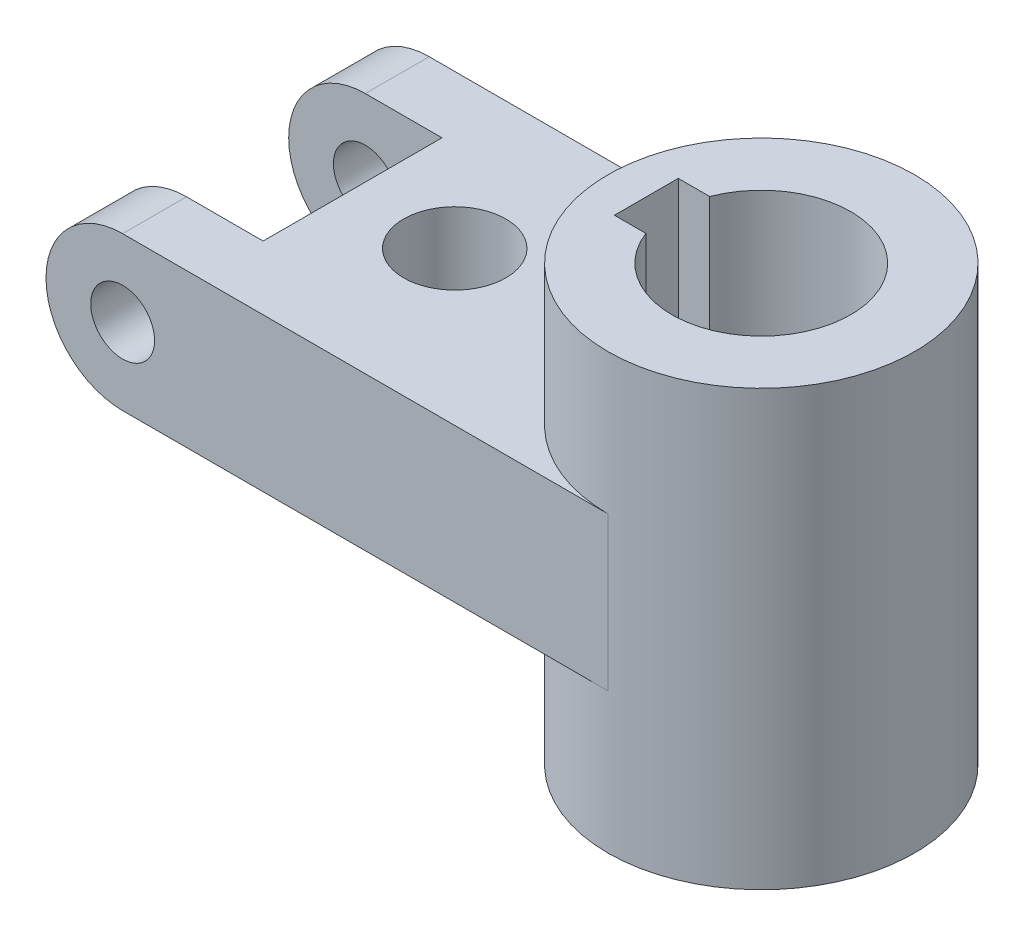
ISO-10303-21;
HEADER;
FILE_DESCRIPTION(('STEP AP214'),'2;1');
FILE_NAME('part.step','',(''),(''),'','','');
FILE_SCHEMA(('AUTOMOTIVE_DESIGN { 1 0 10303 214 1 1 1 1 }'));
ENDSEC;
DATA;
#1=APPLICATION_CONTEXT('core data for automotive mechanical design processes');
#2=APPLICATION_PROTOCOL_DEFINITION('international standard','automotive_design',2000,#1);
#3=PRODUCT_CONTEXT('',#1,'mechanical');
#4=PRODUCT('Part','Part','',(#3));
#5=PRODUCT_RELATED_PRODUCT_CATEGORY('part','',(#4));
#6=PRODUCT_DEFINITION_FORMATION('','',#4);
#7=PRODUCT_DEFINITION_CONTEXT('part definition',#1,'design');
#8=PRODUCT_DEFINITION('design','',#6,#7);
#9=PRODUCT_DEFINITION_SHAPE('','',#8);
#10=(LENGTH_UNIT() NAMED_UNIT(*) SI_UNIT(.MILLI.,.METRE.));
#11=(NAMED_UNIT(*) PLANE_ANGLE_UNIT() SI_UNIT($,.RADIAN.));
#12=(NAMED_UNIT(*) SI_UNIT($,.STERADIAN.) SOLID_ANGLE_UNIT());
#13=UNCERTAINTY_MEASURE_WITH_UNIT(LENGTH_MEASURE(1.E-05),#10,'distance_accuracy_value','');
#14=(GEOMETRIC_REPRESENTATION_CONTEXT(3) GLOBAL_UNCERTAINTY_ASSIGNED_CONTEXT((#13)) GLOBAL_UNIT_ASSIGNED_CONTEXT((#10,
#11,#12)) REPRESENTATION_CONTEXT('',''));
#15=CARTESIAN_POINT('',(0.,0.,0.));
#16=DIRECTION('',(0.,0.,1.));
#17=DIRECTION('',(1.,0.,0.));
#18=AXIS2_PLACEMENT_3D('',#15,#16,#17);
#19=CARTESIAN_POINT('',(0.,-6.,12.));
#20=DIRECTION('',(0.,0.,1.));
#21=DIRECTION('',(1.,0.,0.));
#22=AXIS2_PLACEMENT_3D('',#19,#20,#21);
#23=PLANE('',#22);
#24=CARTESIAN_POINT('',(-16.,0.,12.));
#25=DIRECTION('',(0.,0.,1.));
#26=DIRECTION('',(1.,0.,0.));
#27=AXIS2_PLACEMENT_3D('',#24,#25,#26);
#28=CIRCLE('',#27,2.5);
#29=CARTESIAN_POINT('',(-13.5,0.,12.));
#30=VERTEX_POINT('',#29);
#31=EDGE_CURVE('E374',#30,#30,#28,.T.);
#32=ORIENTED_EDGE('',*,*,#31,.F.);
#33=EDGE_LOOP('',(#32));
#34=FACE_BOUND('',#33,.T.);
#35=DIRECTION('',(1.,0.,0.));
#36=VECTOR('',#35,1.);
#37=CARTESIAN_POINT('',(0.,6.,12.));
#38=LINE('',#37,#36);
#39=CARTESIAN_POINT('',(-16.,6.,12.));
#40=VERTEX_POINT('',#39);
#41=CARTESIAN_POINT('',(22.,6.,12.));
#42=VERTEX_POINT('',#41);
#43=EDGE_CURVE('E184',#40,#42,#38,.T.);
#44=ORIENTED_EDGE('',*,*,#43,.F.);
#45=CARTESIAN_POINT('',(-16.,0.,12.));
#46=DIRECTION('',(0.,0.,1.));
#47=DIRECTION('',(1.,0.,0.));
#48=AXIS2_PLACEMENT_3D('',#45,#46,#47);
#49=CIRCLE('',#48,6.);
#50=CARTESIAN_POINT('',(-16.,-6.,12.));
#51=VERTEX_POINT('',#50);
#52=EDGE_CURVE('E171',#40,#51,#49,.T.);
#53=ORIENTED_EDGE('',*,*,#52,.T.);
#54=DIRECTION('',(1.,0.,0.));
#55=VECTOR('',#54,1.);
#56=CARTESIAN_POINT('',(0.,-6.,12.));
#57=LINE('',#56,#55);
#58=CARTESIAN_POINT('',(22.,-6.,12.));
#59=VERTEX_POINT('',#58);
#60=EDGE_CURVE('E219',#51,#59,#57,.T.);
#61=ORIENTED_EDGE('',*,*,#60,.T.);
#62=DIRECTION('',(0.,1.,0.));
#63=VECTOR('',#62,1.);
#64=CARTESIAN_POINT('',(22.,-6.,12.));
#65=LINE('',#64,#63);
#66=EDGE_CURVE('E190',#59,#42,#65,.T.);
#67=ORIENTED_EDGE('',*,*,#66,.T.);
#68=EDGE_LOOP('',(#44,#53,#61,#67));
#69=FACE_BOUND('',#68,.T.);
#70=ADVANCED_FACE('F83',(#34,#69),#23,.T.);
#71=CARTESIAN_POINT('',(0.,-6.,7.));
#72=DIRECTION('',(0.,0.,1.));
#73=DIRECTION('',(1.,0.,0.));
#74=AXIS2_PLACEMENT_3D('',#71,#72,#73);
#75=PLANE('',#74);
#76=CARTESIAN_POINT('',(-16.,0.,7.));
#77=DIRECTION('',(0.,0.,1.));
#78=DIRECTION('',(1.,0.,0.));
#79=AXIS2_PLACEMENT_3D('',#76,#77,#78);
#80=CIRCLE('',#79,2.5);
#81=CARTESIAN_POINT('',(-13.5,0.,7.));
#82=VERTEX_POINT('',#81);
#83=EDGE_CURVE('E178',#82,#82,#80,.T.);
#84=ORIENTED_EDGE('',*,*,#83,.T.);
#85=EDGE_LOOP('',(#84));
#86=FACE_BOUND('',#85,.T.);
#87=CARTESIAN_POINT('',(-16.,0.,7.));
#88=DIRECTION('',(0.,0.,1.));
#89=DIRECTION('',(1.,0.,0.));
#90=AXIS2_PLACEMENT_3D('',#87,#88,#89);
#91=CIRCLE('',#90,6.);
#92=CARTESIAN_POINT('',(-16.,6.,7.));
#93=VERTEX_POINT('',#92);
#94=CARTESIAN_POINT('',(-16.,-6.,7.));
#95=VERTEX_POINT('',#94);
#96=EDGE_CURVE('E107',#93,#95,#91,.T.);
#97=ORIENTED_EDGE('',*,*,#96,.F.);
#98=DIRECTION('',(1.,0.,0.));
#99=VECTOR('',#98,1.);
#100=CARTESIAN_POINT('',(0.,6.,7.));
#101=LINE('',#100,#99);
#102=CARTESIAN_POINT('',(-9.99999999999999,6.,7.));
#103=VERTEX_POINT('',#102);
#104=EDGE_CURVE('E187',#93,#103,#101,.T.);
#105=ORIENTED_EDGE('',*,*,#104,.T.);
#106=DIRECTION('',(0.,1.,0.));
#107=VECTOR('',#106,1.);
#108=CARTESIAN_POINT('',(-9.99999999999999,-6.,7.));
#109=LINE('',#108,#107);
#110=CARTESIAN_POINT('',(-9.99999999999999,-6.,7.));
#111=VERTEX_POINT('',#110);
#112=EDGE_CURVE('E226',#111,#103,#109,.T.);
#113=ORIENTED_EDGE('',*,*,#112,.F.);
#114=DIRECTION('',(1.,0.,0.));
#115=VECTOR('',#114,1.);
#116=CARTESIAN_POINT('',(0.,-6.,7.));
#117=LINE('',#116,#115);
#118=EDGE_CURVE('E216',#95,#111,#117,.T.);
#119=ORIENTED_EDGE('',*,*,#118,.F.);
#120=EDGE_LOOP('',(#97,#105,#113,#119));
#121=FACE_BOUND('',#120,.T.);
#122=ADVANCED_FACE('F353',(#86,#121),#75,.F.);
#123=CARTESIAN_POINT('',(0.,-6.,-7.));
#124=DIRECTION('',(0.,0.,1.));
#125=DIRECTION('',(1.,0.,0.));
#126=AXIS2_PLACEMENT_3D('',#123,#124,#125);
#127=PLANE('',#126);
#128=CARTESIAN_POINT('',(-16.,0.,-7.));
#129=DIRECTION('',(0.,0.,1.));
#130=DIRECTION('',(1.,0.,0.));
#131=AXIS2_PLACEMENT_3D('',#128,#129,#130);
#132=CIRCLE('',#131,2.5);
#133=CARTESIAN_POINT('',(-13.5,0.,-7.));
#134=VERTEX_POINT('',#133);
#135=EDGE_CURVE('E367',#134,#134,#132,.T.);
#136=ORIENTED_EDGE('',*,*,#135,.F.);
#137=EDGE_LOOP('',(#136));
#138=FACE_BOUND('',#137,.T.);
#139=DIRECTION('',(1.,0.,0.));
#140=VECTOR('',#139,1.);
#141=CARTESIAN_POINT('',(0.,6.,-7.));
#142=LINE('',#141,#140);
#143=CARTESIAN_POINT('',(-16.,6.,-7.));
#144=VERTEX_POINT('',#143);
#145=CARTESIAN_POINT('',(-9.99999999999999,6.,-7.));
#146=VERTEX_POINT('',#145);
#147=EDGE_CURVE('E336',#144,#146,#142,.T.);
#148=ORIENTED_EDGE('',*,*,#147,.F.);
#149=CARTESIAN_POINT('',(-16.,0.,-7.));
#150=DIRECTION('',(0.,0.,1.));
#151=DIRECTION('',(1.,0.,0.));
#152=AXIS2_PLACEMENT_3D('',#149,#150,#151);
#153=CIRCLE('',#152,6.);
#154=CARTESIAN_POINT('',(-16.,-6.,-7.));
#155=VERTEX_POINT('',#154);
#156=EDGE_CURVE('E355',#144,#155,#153,.T.);
#157=ORIENTED_EDGE('',*,*,#156,.T.);
#158=DIRECTION('',(1.,0.,0.));
#159=VECTOR('',#158,1.);
#160=CARTESIAN_POINT('',(0.,-6.,-7.));
#161=LINE('',#160,#159);
#162=CARTESIAN_POINT('',(-9.99999999999999,-6.,-7.));
#163=VERTEX_POINT('',#162);
#164=EDGE_CURVE('E209',#155,#163,#161,.T.);
#165=ORIENTED_EDGE('',*,*,#164,.T.);
#166=DIRECTION('',(0.,1.,0.));
#167=VECTOR('',#166,1.);
#168=CARTESIAN_POINT('',(-9.99999999999999,-6.,-7.));
#169=LINE('',#168,#167);
#170=EDGE_CURVE('E230',#163,#146,#169,.T.);
#171=ORIENTED_EDGE('',*,*,#170,.T.);
#172=EDGE_LOOP('',(#148,#157,#165,#171));
#173=FACE_BOUND('',#172,.T.);
#174=ADVANCED_FACE('F392',(#138,#173),#127,.T.);
#175=CARTESIAN_POINT('',(0.,-6.,-12.));
#176=DIRECTION('',(0.,0.,1.));
#177=DIRECTION('',(1.,0.,0.));
#178=AXIS2_PLACEMENT_3D('',#175,#176,#177);
#179=PLANE('',#178);
#180=CARTESIAN_POINT('',(-16.,0.,-12.));
#181=DIRECTION('',(0.,0.,1.));
#182=DIRECTION('',(1.,0.,0.));
#183=AXIS2_PLACEMENT_3D('',#180,#181,#182);
#184=CIRCLE('',#183,2.5);
#185=CARTESIAN_POINT('',(-13.5,0.,-12.));
#186=VERTEX_POINT('',#185);
#187=EDGE_CURVE('E375',#186,#186,#184,.T.);
#188=ORIENTED_EDGE('',*,*,#187,.T.);
#189=EDGE_LOOP('',(#188));
#190=FACE_BOUND('',#189,.T.);
#191=CARTESIAN_POINT('',(-16.,0.,-12.));
#192=DIRECTION('',(0.,0.,1.));
#193=DIRECTION('',(1.,0.,0.));
#194=AXIS2_PLACEMENT_3D('',#191,#192,#193);
#195=CIRCLE('',#194,6.);
#196=CARTESIAN_POINT('',(-16.,6.,-12.));
#197=VERTEX_POINT('',#196);
#198=CARTESIAN_POINT('',(-16.,-6.,-12.));
#199=VERTEX_POINT('',#198);
#200=EDGE_CURVE('E99',#197,#199,#195,.T.);
#201=ORIENTED_EDGE('',*,*,#200,.F.);
#202=DIRECTION('',(1.,0.,0.));
#203=VECTOR('',#202,1.);
#204=CARTESIAN_POINT('',(0.,6.,-12.));
#205=LINE('',#204,#203);
#206=CARTESIAN_POINT('',(22.,6.,-12.));
#207=VERTEX_POINT('',#206);
#208=EDGE_CURVE('E329',#197,#207,#205,.T.);
#209=ORIENTED_EDGE('',*,*,#208,.T.);
#210=DIRECTION('',(0.,1.,0.));
#211=VECTOR('',#210,1.);
#212=CARTESIAN_POINT('',(22.,-6.,-12.));
#213=LINE('',#212,#211);
#214=CARTESIAN_POINT('',(22.,-6.,-12.));
#215=VERTEX_POINT('',#214);
#216=EDGE_CURVE('E222',#215,#207,#213,.T.);
#217=ORIENTED_EDGE('',*,*,#216,.F.);
#218=DIRECTION('',(1.,0.,0.));
#219=VECTOR('',#218,1.);
#220=CARTESIAN_POINT('',(0.,-6.,-12.));
#221=LINE('',#220,#219);
#222=EDGE_CURVE('E206',#199,#215,#221,.T.);
#223=ORIENTED_EDGE('',*,*,#222,.F.);
#224=EDGE_LOOP('',(#201,#209,#217,#223));
#225=FACE_BOUND('',#224,.T.);
#226=ADVANCED_FACE('F328',(#190,#225),#179,.F.);
#227=CARTESIAN_POINT('',(0.,6.,0.));
#228=DIRECTION('',(0.,1.,0.));
#229=DIRECTION('',(0.,0.,1.));
#230=AXIS2_PLACEMENT_3D('',#227,#228,#229);
#231=PLANE('',#230);
#232=CARTESIAN_POINT('',(-1.99999999999999,6.,0.));
#233=DIRECTION('',(0.,1.,0.));
#234=DIRECTION('',(0.,0.,1.));
#235=AXIS2_PLACEMENT_3D('',#232,#233,#234);
#236=CIRCLE('',#235,4.);
#237=CARTESIAN_POINT('',(-1.99999999999999,6.,4.));
#238=VERTEX_POINT('',#237);
#239=EDGE_CURVE('E332',#238,#238,#236,.T.);
#240=ORIENTED_EDGE('',*,*,#239,.F.);
#241=EDGE_LOOP('',(#240));
#242=FACE_BOUND('',#241,.T.);
#243=ORIENTED_EDGE('',*,*,#208,.F.);
#244=DIRECTION('',(0.,0.,1.));
#245=VECTOR('',#244,1.);
#246=CARTESIAN_POINT('',(-16.,6.,-12.));
#247=LINE('',#246,#245);
#248=EDGE_CURVE('E371',#197,#144,#247,.T.);
#249=ORIENTED_EDGE('',*,*,#248,.T.);
#250=ORIENTED_EDGE('',*,*,#147,.T.);
#251=DIRECTION('',(0.,0.,1.));
#252=VECTOR('',#251,1.);
#253=CARTESIAN_POINT('',(-9.99999999999999,6.,0.));
#254=LINE('',#253,#252);
#255=EDGE_CURVE('E199',#146,#103,#254,.T.);
#256=ORIENTED_EDGE('',*,*,#255,.T.);
#257=ORIENTED_EDGE('',*,*,#104,.F.);
#258=DIRECTION('',(0.,0.,1.));
#259=VECTOR('',#258,1.);
#260=CARTESIAN_POINT('',(-16.,6.,-12.));
#261=LINE('',#260,#259);
#262=EDGE_CURVE('E14',#93,#40,#261,.T.);
#263=ORIENTED_EDGE('',*,*,#262,.T.);
#264=ORIENTED_EDGE('',*,*,#43,.T.);
#265=CARTESIAN_POINT('',(22.,6.,0.));
#266=DIRECTION('',(0.,1.,0.));
#267=DIRECTION('',(0.,0.,1.));
#268=AXIS2_PLACEMENT_3D('',#265,#266,#267);
#269=CIRCLE('',#268,12.);
#270=EDGE_CURVE('E322',#207,#42,#269,.T.);
#271=ORIENTED_EDGE('',*,*,#270,.F.);
#272=EDGE_LOOP('',(#243,#249,#250,#256,#257,#263,#264,#271));
#273=FACE_BOUND('',#272,.T.);
#274=ADVANCED_FACE('F182',(#242,#273),#231,.T.);
#275=CARTESIAN_POINT('',(0.,-6.,0.));
#276=DIRECTION('',(0.,1.,0.));
#277=DIRECTION('',(0.,0.,1.));
#278=AXIS2_PLACEMENT_3D('',#275,#276,#277);
#279=PLANE('',#278);
#280=CARTESIAN_POINT('',(-1.99999999999999,-6.,0.));
#281=DIRECTION('',(0.,1.,0.));
#282=DIRECTION('',(0.,0.,1.));
#283=AXIS2_PLACEMENT_3D('',#280,#281,#282);
#284=CIRCLE('',#283,4.);
#285=CARTESIAN_POINT('',(-1.99999999999999,-6.,4.));
#286=VERTEX_POINT('',#285);
#287=EDGE_CURVE('E192',#286,#286,#284,.T.);
#288=ORIENTED_EDGE('',*,*,#287,.T.);
#289=EDGE_LOOP('',(#288));
#290=FACE_BOUND('',#289,.T.);
#291=DIRECTION('',(0.,0.,1.));
#292=VECTOR('',#291,1.);
#293=CARTESIAN_POINT('',(-16.,-6.,-12.));
#294=LINE('',#293,#292);
#295=EDGE_CURVE('E326',#199,#155,#294,.T.);
#296=ORIENTED_EDGE('',*,*,#295,.F.);
#297=ORIENTED_EDGE('',*,*,#222,.T.);
#298=CARTESIAN_POINT('',(22.,-6.,0.));
#299=DIRECTION('',(0.,1.,0.));
#300=DIRECTION('',(0.,0.,1.));
#301=AXIS2_PLACEMENT_3D('',#298,#299,#300);
#302=CIRCLE('',#301,12.);
#303=EDGE_CURVE('E197',#215,#59,#302,.T.);
#304=ORIENTED_EDGE('',*,*,#303,.T.);
#305=ORIENTED_EDGE('',*,*,#60,.F.);
#306=DIRECTION('',(0.,0.,1.));
#307=VECTOR('',#306,1.);
#308=CARTESIAN_POINT('',(-16.,-6.,-12.));
#309=LINE('',#308,#307);
#310=EDGE_CURVE('E92',#95,#51,#309,.T.);
#311=ORIENTED_EDGE('',*,*,#310,.F.);
#312=ORIENTED_EDGE('',*,*,#118,.T.);
#313=DIRECTION('',(0.,0.,1.));
#314=VECTOR('',#313,1.);
#315=CARTESIAN_POINT('',(-9.99999999999999,-6.,0.));
#316=LINE('',#315,#314);
#317=EDGE_CURVE('E212',#163,#111,#316,.T.);
#318=ORIENTED_EDGE('',*,*,#317,.F.);
#319=ORIENTED_EDGE('',*,*,#164,.F.);
#320=EDGE_LOOP('',(#296,#297,#304,#305,#311,#312,#318,#319));
#321=FACE_BOUND('',#320,.T.);
#322=ADVANCED_FACE('F316',(#290,#321),#279,.F.);
#323=CARTESIAN_POINT('',(22.,-17.,0.));
#324=DIRECTION('',(0.,1.,0.));
#325=DIRECTION('',(0.,0.,1.));
#326=AXIS2_PLACEMENT_3D('',#323,#324,#325);
#327=CYLINDRICAL_SURFACE('',#326,12.);
#328=CARTESIAN_POINT('',(22.,-17.,0.));
#329=DIRECTION('',(0.,1.,0.));
#330=DIRECTION('',(0.,0.,1.));
#331=AXIS2_PLACEMENT_3D('',#328,#329,#330);
#332=CIRCLE('',#331,12.);
#333=CARTESIAN_POINT('',(22.,-17.,12.));
#334=VERTEX_POINT('',#333);
#335=EDGE_CURVE('E269',#334,#334,#332,.T.);
#336=ORIENTED_EDGE('',*,*,#335,.T.);
#337=EDGE_LOOP('',(#336));
#338=FACE_BOUND('',#337,.T.);
#339=CARTESIAN_POINT('',(22.,17.,0.));
#340=DIRECTION('',(0.,1.,0.));
#341=DIRECTION('',(0.,0.,1.));
#342=AXIS2_PLACEMENT_3D('',#339,#340,#341);
#343=CIRCLE('',#342,12.);
#344=CARTESIAN_POINT('',(22.,17.,12.));
#345=VERTEX_POINT('',#344);
#346=EDGE_CURVE('E252',#345,#345,#343,.T.);
#347=ORIENTED_EDGE('',*,*,#346,.F.);
#348=EDGE_LOOP('',(#347));
#349=FACE_BOUND('',#348,.T.);
#350=ORIENTED_EDGE('',*,*,#66,.F.);
#351=ORIENTED_EDGE('',*,*,#303,.F.);
#352=ORIENTED_EDGE('',*,*,#216,.T.);
#353=ORIENTED_EDGE('',*,*,#270,.T.);
#354=EDGE_LOOP('',(#350,#351,#352,#353));
#355=FACE_BOUND('',#354,.T.);
#356=ADVANCED_FACE('F313',(#338,#349,#355),#327,.T.);
#357=CARTESIAN_POINT('',(22.,-17.,0.));
#358=DIRECTION('',(0.,1.,0.));
#359=DIRECTION('',(0.,0.,1.));
#360=AXIS2_PLACEMENT_3D('',#357,#358,#359);
#361=CYLINDRICAL_SURFACE('',#360,7.);
#362=DIRECTION('',(0.,1.,0.));
#363=VECTOR('',#362,1.);
#364=CARTESIAN_POINT('',(15.461651584689,-17.,2.5));
#365=LINE('',#364,#363);
#366=CARTESIAN_POINT('',(15.461651584689,-17.,2.5));
#367=VERTEX_POINT('',#366);
#368=CARTESIAN_POINT('',(15.461651584689,17.,2.5));
#369=VERTEX_POINT('',#368);
#370=EDGE_CURVE('E273',#367,#369,#365,.T.);
#371=ORIENTED_EDGE('',*,*,#370,.T.);
#372=CARTESIAN_POINT('',(22.,17.,0.));
#373=DIRECTION('',(0.,1.,0.));
#374=DIRECTION('',(0.,0.,1.));
#375=AXIS2_PLACEMENT_3D('',#372,#373,#374);
#376=CIRCLE('',#375,7.);
#377=CARTESIAN_POINT('',(15.461651584689,17.,-2.5));
#378=VERTEX_POINT('',#377);
#379=EDGE_CURVE('E225',#369,#378,#376,.T.);
#380=ORIENTED_EDGE('',*,*,#379,.T.);
#381=DIRECTION('',(0.,1.,0.));
#382=VECTOR('',#381,1.);
#383=CARTESIAN_POINT('',(15.461651584689,-17.,-2.5));
#384=LINE('',#383,#382);
#385=CARTESIAN_POINT('',(15.461651584689,-17.,-2.5));
#386=VERTEX_POINT('',#385);
#387=EDGE_CURVE('E274',#386,#378,#384,.T.);
#388=ORIENTED_EDGE('',*,*,#387,.F.);
#389=CARTESIAN_POINT('',(22.,-17.,0.));
#390=DIRECTION('',(0.,1.,0.));
#391=DIRECTION('',(0.,0.,1.));
#392=AXIS2_PLACEMENT_3D('',#389,#390,#391);
#393=CIRCLE('',#392,7.);
#394=EDGE_CURVE('E256',#367,#386,#393,.T.);
#395=ORIENTED_EDGE('',*,*,#394,.F.);
#396=EDGE_LOOP('',(#371,#380,#388,#395));
#397=FACE_BOUND('',#396,.T.);
#398=ADVANCED_FACE('F85',(#397),#361,.F.);
#399=CARTESIAN_POINT('',(0.,-17.,-2.5));
#400=DIRECTION('',(0.,0.,1.));
#401=DIRECTION('',(1.,0.,0.));
#402=AXIS2_PLACEMENT_3D('',#399,#400,#401);
#403=PLANE('',#402);
#404=ORIENTED_EDGE('',*,*,#387,.T.);
#405=DIRECTION('',(1.,0.,0.));
#406=VECTOR('',#405,1.);
#407=CARTESIAN_POINT('',(0.,17.,-2.5));
#408=LINE('',#407,#406);
#409=CARTESIAN_POINT('',(13.,17.,-2.5));
#410=VERTEX_POINT('',#409);
#411=EDGE_CURVE('E248',#410,#378,#408,.T.);
#412=ORIENTED_EDGE('',*,*,#411,.F.);
#413=DIRECTION('',(0.,1.,0.));
#414=VECTOR('',#413,1.);
#415=CARTESIAN_POINT('',(13.,-17.,-2.5));
#416=LINE('',#415,#414);
#417=CARTESIAN_POINT('',(13.,-17.,-2.5));
#418=VERTEX_POINT('',#417);
#419=EDGE_CURVE('E277',#418,#410,#416,.T.);
#420=ORIENTED_EDGE('',*,*,#419,.F.);
#421=DIRECTION('',(1.,0.,0.));
#422=VECTOR('',#421,1.);
#423=CARTESIAN_POINT('',(0.,-17.,-2.5));
#424=LINE('',#423,#422);
#425=EDGE_CURVE('E265',#418,#386,#424,.T.);
#426=ORIENTED_EDGE('',*,*,#425,.T.);
#427=EDGE_LOOP('',(#404,#412,#420,#426));
#428=FACE_BOUND('',#427,.T.);
#429=ADVANCED_FACE('F305',(#428),#403,.T.);
#430=CARTESIAN_POINT('',(13.,-17.,0.));
#431=DIRECTION('',(-1.,0.,0.));
#432=DIRECTION('',(0.,0.,1.));
#433=AXIS2_PLACEMENT_3D('',#430,#431,#432);
#434=PLANE('',#433);
#435=ORIENTED_EDGE('',*,*,#419,.T.);
#436=DIRECTION('',(0.,0.,1.));
#437=VECTOR('',#436,1.);
#438=CARTESIAN_POINT('',(13.,17.,0.));
#439=LINE('',#438,#437);
#440=CARTESIAN_POINT('',(13.,17.,2.5));
#441=VERTEX_POINT('',#440);
#442=EDGE_CURVE('E244',#410,#441,#439,.T.);
#443=ORIENTED_EDGE('',*,*,#442,.T.);
#444=DIRECTION('',(0.,1.,0.));
#445=VECTOR('',#444,1.);
#446=CARTESIAN_POINT('',(13.,-17.,2.5));
#447=LINE('',#446,#445);
#448=CARTESIAN_POINT('',(13.,-17.,2.5));
#449=VERTEX_POINT('',#448);
#450=EDGE_CURVE('E280',#449,#441,#447,.T.);
#451=ORIENTED_EDGE('',*,*,#450,.F.);
#452=DIRECTION('',(0.,0.,1.));
#453=VECTOR('',#452,1.);
#454=CARTESIAN_POINT('',(13.,-17.,0.));
#455=LINE('',#454,#453);
#456=EDGE_CURVE('E262',#418,#449,#455,.T.);
#457=ORIENTED_EDGE('',*,*,#456,.F.);
#458=EDGE_LOOP('',(#435,#443,#451,#457));
#459=FACE_BOUND('',#458,.T.);
#460=ADVANCED_FACE('F302',(#459),#434,.F.);
#461=CARTESIAN_POINT('',(0.,-17.,2.5));
#462=DIRECTION('',(0.,0.,1.));
#463=DIRECTION('',(1.,0.,0.));
#464=AXIS2_PLACEMENT_3D('',#461,#462,#463);
#465=PLANE('',#464);
#466=ORIENTED_EDGE('',*,*,#450,.T.);
#467=DIRECTION('',(1.,0.,0.));
#468=VECTOR('',#467,1.);
#469=CARTESIAN_POINT('',(0.,17.,2.5));
#470=LINE('',#469,#468);
#471=EDGE_CURVE('E240',#441,#369,#470,.T.);
#472=ORIENTED_EDGE('',*,*,#471,.T.);
#473=ORIENTED_EDGE('',*,*,#370,.F.);
#474=DIRECTION('',(1.,0.,0.));
#475=VECTOR('',#474,1.);
#476=CARTESIAN_POINT('',(0.,-17.,2.5));
#477=LINE('',#476,#475);
#478=EDGE_CURVE('E259',#449,#367,#477,.T.);
#479=ORIENTED_EDGE('',*,*,#478,.F.);
#480=EDGE_LOOP('',(#466,#472,#473,#479));
#481=FACE_BOUND('',#480,.T.);
#482=ADVANCED_FACE('F298',(#481),#465,.F.);
#483=CARTESIAN_POINT('',(0.,-17.,0.));
#484=DIRECTION('',(0.,1.,0.));
#485=DIRECTION('',(0.,0.,1.));
#486=AXIS2_PLACEMENT_3D('',#483,#484,#485);
#487=PLANE('',#486);
#488=ORIENTED_EDGE('',*,*,#394,.T.);
#489=ORIENTED_EDGE('',*,*,#425,.F.);
#490=ORIENTED_EDGE('',*,*,#456,.T.);
#491=ORIENTED_EDGE('',*,*,#478,.T.);
#492=EDGE_LOOP('',(#488,#489,#490,#491));
#493=FACE_BOUND('',#492,.T.);
#494=ORIENTED_EDGE('',*,*,#335,.F.);
#495=EDGE_LOOP('',(#494));
#496=FACE_BOUND('',#495,.T.);
#497=ADVANCED_FACE('F307',(#493,#496),#487,.F.);
#498=CARTESIAN_POINT('',(0.,17.,0.));
#499=DIRECTION('',(0.,1.,0.));
#500=DIRECTION('',(0.,0.,1.));
#501=AXIS2_PLACEMENT_3D('',#498,#499,#500);
#502=PLANE('',#501);
#503=ORIENTED_EDGE('',*,*,#379,.F.);
#504=ORIENTED_EDGE('',*,*,#471,.F.);
#505=ORIENTED_EDGE('',*,*,#442,.F.);
#506=ORIENTED_EDGE('',*,*,#411,.T.);
#507=EDGE_LOOP('',(#503,#504,#505,#506));
#508=FACE_BOUND('',#507,.T.);
#509=ORIENTED_EDGE('',*,*,#346,.T.);
#510=EDGE_LOOP('',(#509));
#511=FACE_BOUND('',#510,.T.);
#512=ADVANCED_FACE('F294',(#508,#511),#502,.T.);
#513=CARTESIAN_POINT('',(-9.99999999999999,-6.,0.));
#514=DIRECTION('',(-1.,0.,0.));
#515=DIRECTION('',(0.,0.,1.));
#516=AXIS2_PLACEMENT_3D('',#513,#514,#515);
#517=PLANE('',#516);
#518=ORIENTED_EDGE('',*,*,#112,.T.);
#519=ORIENTED_EDGE('',*,*,#255,.F.);
#520=ORIENTED_EDGE('',*,*,#170,.F.);
#521=ORIENTED_EDGE('',*,*,#317,.T.);
#522=EDGE_LOOP('',(#518,#519,#520,#521));
#523=FACE_BOUND('',#522,.T.);
#524=ADVANCED_FACE('F348',(#523),#517,.T.);
#525=CARTESIAN_POINT('',(-1.99999999999999,-6.,0.));
#526=DIRECTION('',(0.,1.,0.));
#527=DIRECTION('',(0.,0.,1.));
#528=AXIS2_PLACEMENT_3D('',#525,#526,#527);
#529=CYLINDRICAL_SURFACE('',#528,4.);
#530=ORIENTED_EDGE('',*,*,#287,.F.);
#531=EDGE_LOOP('',(#530));
#532=FACE_BOUND('',#531,.T.);
#533=ORIENTED_EDGE('',*,*,#239,.T.);
#534=EDGE_LOOP('',(#533));
#535=FACE_BOUND('',#534,.T.);
#536=ADVANCED_FACE('F400',(#532,#535),#529,.F.);
#537=CARTESIAN_POINT('',(-16.,0.,-12.));
#538=DIRECTION('',(0.,0.,1.));
#539=DIRECTION('',(1.,0.,0.));
#540=AXIS2_PLACEMENT_3D('',#537,#538,#539);
#541=CYLINDRICAL_SURFACE('',#540,6.);
#542=ORIENTED_EDGE('',*,*,#96,.T.);
#543=ORIENTED_EDGE('',*,*,#310,.T.);
#544=ORIENTED_EDGE('',*,*,#52,.F.);
#545=ORIENTED_EDGE('',*,*,#262,.F.);
#546=EDGE_LOOP('',(#542,#543,#544,#545));
#547=FACE_BOUND('',#546,.T.);
#548=ADVANCED_FACE('F172',(#547),#541,.T.);
#549=ORIENTED_EDGE('',*,*,#156,.F.);
#550=ORIENTED_EDGE('',*,*,#248,.F.);
#551=ORIENTED_EDGE('',*,*,#200,.T.);
#552=ORIENTED_EDGE('',*,*,#295,.T.);
#553=EDGE_LOOP('',(#549,#550,#551,#552));
#554=FACE_BOUND('',#553,.T.);
#555=ADVANCED_FACE('F492',(#554),#541,.T.);
#556=CARTESIAN_POINT('',(-16.,0.,-12.));
#557=DIRECTION('',(0.,0.,1.));
#558=DIRECTION('',(1.,0.,0.));
#559=AXIS2_PLACEMENT_3D('',#556,#557,#558);
#560=CYLINDRICAL_SURFACE('',#559,2.5);
#561=ORIENTED_EDGE('',*,*,#135,.T.);
#562=EDGE_LOOP('',(#561));
#563=FACE_BOUND('',#562,.T.);
#564=ORIENTED_EDGE('',*,*,#187,.F.);
#565=EDGE_LOOP('',(#564));
#566=FACE_BOUND('',#565,.T.);
#567=ADVANCED_FACE('F504',(#563,#566),#560,.F.);
#568=ORIENTED_EDGE('',*,*,#31,.T.);
#569=EDGE_LOOP('',(#568));
#570=FACE_BOUND('',#569,.T.);
#571=ORIENTED_EDGE('',*,*,#83,.F.);
#572=EDGE_LOOP('',(#571));
#573=FACE_BOUND('',#572,.T.);
#574=ADVANCED_FACE('F383',(#570,#573),#560,.F.);
#575=CLOSED_SHELL('',(#70,#122,#174,#226,#274,#322,#356,#398,#429,#460,#482,#497,#512,#524,#536,
#548,#555,#567,#574));
#576=MANIFOLD_SOLID_BREP('B2',#575);
#577=ADVANCED_BREP_SHAPE_REPRESENTATION('',(#18,#576),#14);
#578=SHAPE_DEFINITION_REPRESENTATION(#9,#577);
ENDSEC;
END-ISO-10303-21;
